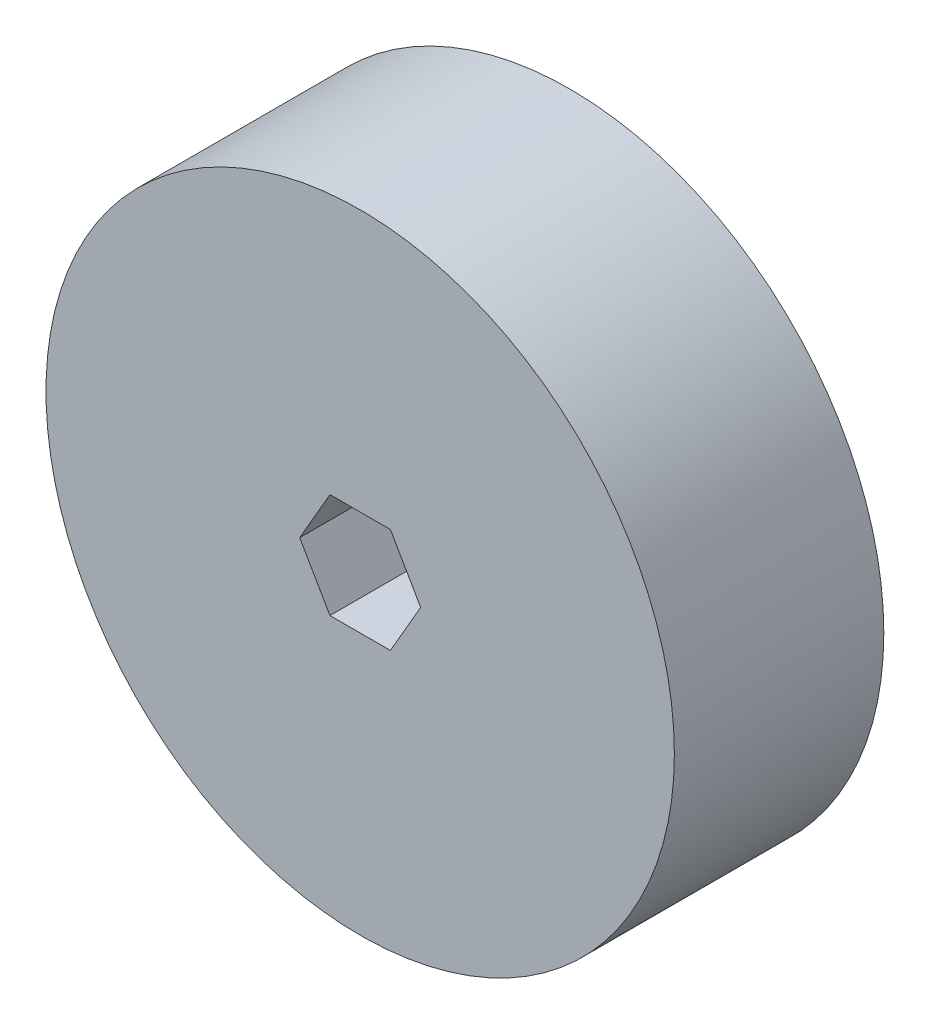
ISO-10303-21;
HEADER;
FILE_DESCRIPTION(('STEP AP214'),'2;1');
FILE_NAME('part.step','',(''),(''),'','','');
FILE_SCHEMA(('AUTOMOTIVE_DESIGN { 1 0 10303 214 1 1 1 1 }'));
ENDSEC;
DATA;
#1=APPLICATION_CONTEXT('core data for automotive mechanical design processes');
#2=APPLICATION_PROTOCOL_DEFINITION('international standard','automotive_design',2000,#1);
#3=PRODUCT_CONTEXT('',#1,'mechanical');
#4=PRODUCT('Part','Part','',(#3));
#5=PRODUCT_RELATED_PRODUCT_CATEGORY('part','',(#4));
#6=PRODUCT_DEFINITION_FORMATION('','',#4);
#7=PRODUCT_DEFINITION_CONTEXT('part definition',#1,'design');
#8=PRODUCT_DEFINITION('design','',#6,#7);
#9=PRODUCT_DEFINITION_SHAPE('','',#8);
#10=(LENGTH_UNIT() NAMED_UNIT(*) SI_UNIT(.MILLI.,.METRE.));
#11=(NAMED_UNIT(*) PLANE_ANGLE_UNIT() SI_UNIT($,.RADIAN.));
#12=(NAMED_UNIT(*) SI_UNIT($,.STERADIAN.) SOLID_ANGLE_UNIT());
#13=UNCERTAINTY_MEASURE_WITH_UNIT(LENGTH_MEASURE(1.E-05),#10,'distance_accuracy_value','');
#14=(GEOMETRIC_REPRESENTATION_CONTEXT(3) GLOBAL_UNCERTAINTY_ASSIGNED_CONTEXT((#13)) GLOBAL_UNIT_ASSIGNED_CONTEXT((#10,
#11,#12)) REPRESENTATION_CONTEXT('',''));
#15=CARTESIAN_POINT('',(0.,0.,0.));
#16=DIRECTION('',(0.,0.,1.));
#17=DIRECTION('',(1.,0.,0.));
#18=AXIS2_PLACEMENT_3D('',#15,#16,#17);
#19=CARTESIAN_POINT('',(0.,0.,25.4));
#20=DIRECTION('',(0.,0.,1.));
#21=DIRECTION('',(1.,0.,0.));
#22=AXIS2_PLACEMENT_3D('',#19,#20,#21);
#23=PLANE('',#22);
#24=CARTESIAN_POINT('',(0.,0.,25.4));
#25=DIRECTION('',(0.,0.,1.));
#26=DIRECTION('',(1.,0.,0.));
#27=AXIS2_PLACEMENT_3D('',#24,#25,#26);
#28=CIRCLE('',#27,38.1);
#29=CARTESIAN_POINT('',(38.1,0.,25.4));
#30=VERTEX_POINT('',#29);
#31=EDGE_CURVE('E11',#30,#30,#28,.T.);
#32=ORIENTED_EDGE('',*,*,#31,.T.);
#33=EDGE_LOOP('',(#32));
#34=FACE_BOUND('',#33,.T.);
#35=DIRECTION('',(-0.5,-0.866025403784438,0.));
#36=VECTOR('',#35,1.);
#37=CARTESIAN_POINT('',(-3.66617420935412,6.35,25.4));
#38=LINE('',#37,#36);
#39=CARTESIAN_POINT('',(-3.66617420935412,6.35,25.4));
#40=VERTEX_POINT('',#39);
#41=CARTESIAN_POINT('',(-7.33234841870825,0.,25.4));
#42=VERTEX_POINT('',#41);
#43=EDGE_CURVE('E114',#40,#42,#38,.T.);
#44=ORIENTED_EDGE('',*,*,#43,.F.);
#45=DIRECTION('',(-1.,0.,0.));
#46=VECTOR('',#45,1.);
#47=CARTESIAN_POINT('',(3.66617420935412,6.35,25.4));
#48=LINE('',#47,#46);
#49=CARTESIAN_POINT('',(3.66617420935412,6.35,25.4));
#50=VERTEX_POINT('',#49);
#51=EDGE_CURVE('E105',#50,#40,#48,.T.);
#52=ORIENTED_EDGE('',*,*,#51,.F.);
#53=DIRECTION('',(-0.5,0.866025403784439,0.));
#54=VECTOR('',#53,1.);
#55=CARTESIAN_POINT('',(7.33234841870825,0.,25.4));
#56=LINE('',#55,#54);
#57=CARTESIAN_POINT('',(7.33234841870825,0.,25.4));
#58=VERTEX_POINT('',#57);
#59=EDGE_CURVE('E139',#58,#50,#56,.T.);
#60=ORIENTED_EDGE('',*,*,#59,.F.);
#61=DIRECTION('',(0.5,0.866025403784438,0.));
#62=VECTOR('',#61,1.);
#63=CARTESIAN_POINT('',(3.66617420935413,-6.35,25.4));
#64=LINE('',#63,#62);
#65=CARTESIAN_POINT('',(3.66617420935413,-6.35,25.4));
#66=VERTEX_POINT('',#65);
#67=EDGE_CURVE('E136',#66,#58,#64,.T.);
#68=ORIENTED_EDGE('',*,*,#67,.F.);
#69=DIRECTION('',(1.,0.,0.));
#70=VECTOR('',#69,1.);
#71=CARTESIAN_POINT('',(-3.66617420935412,-6.35,25.4));
#72=LINE('',#71,#70);
#73=CARTESIAN_POINT('',(-3.66617420935412,-6.35,25.4));
#74=VERTEX_POINT('',#73);
#75=EDGE_CURVE('E131',#74,#66,#72,.T.);
#76=ORIENTED_EDGE('',*,*,#75,.F.);
#77=DIRECTION('',(0.5,-0.866025403784439,0.));
#78=VECTOR('',#77,1.);
#79=CARTESIAN_POINT('',(-7.33234841870825,0.,25.4));
#80=LINE('',#79,#78);
#81=EDGE_CURVE('E127',#42,#74,#80,.T.);
#82=ORIENTED_EDGE('',*,*,#81,.F.);
#83=EDGE_LOOP('',(#44,#52,#60,#68,#76,#82));
#84=FACE_BOUND('',#83,.T.);
#85=ADVANCED_FACE('F51',(#34,#84),#23,.T.);
#86=CARTESIAN_POINT('',(0.,0.,0.));
#87=DIRECTION('',(0.,0.,1.));
#88=DIRECTION('',(1.,0.,0.));
#89=AXIS2_PLACEMENT_3D('',#86,#87,#88);
#90=PLANE('',#89);
#91=CARTESIAN_POINT('',(0.,0.,0.));
#92=DIRECTION('',(0.,0.,1.));
#93=DIRECTION('',(1.,0.,0.));
#94=AXIS2_PLACEMENT_3D('',#91,#92,#93);
#95=CIRCLE('',#94,38.1);
#96=CARTESIAN_POINT('',(38.1,0.,0.));
#97=VERTEX_POINT('',#96);
#98=EDGE_CURVE('E55',#97,#97,#95,.T.);
#99=ORIENTED_EDGE('',*,*,#98,.F.);
#100=EDGE_LOOP('',(#99));
#101=FACE_BOUND('',#100,.T.);
#102=DIRECTION('',(-1.,0.,0.));
#103=VECTOR('',#102,1.);
#104=CARTESIAN_POINT('',(3.66617420935412,6.35,0.));
#105=LINE('',#104,#103);
#106=CARTESIAN_POINT('',(3.66617420935412,6.35,0.));
#107=VERTEX_POINT('',#106);
#108=CARTESIAN_POINT('',(-3.66617420935412,6.35,0.));
#109=VERTEX_POINT('',#108);
#110=EDGE_CURVE('E75',#107,#109,#105,.T.);
#111=ORIENTED_EDGE('',*,*,#110,.T.);
#112=DIRECTION('',(-0.5,-0.866025403784438,0.));
#113=VECTOR('',#112,1.);
#114=CARTESIAN_POINT('',(-3.66617420935412,6.35,0.));
#115=LINE('',#114,#113);
#116=CARTESIAN_POINT('',(-7.33234841870825,0.,0.));
#117=VERTEX_POINT('',#116);
#118=EDGE_CURVE('E121',#109,#117,#115,.T.);
#119=ORIENTED_EDGE('',*,*,#118,.T.);
#120=DIRECTION('',(0.5,-0.866025403784439,0.));
#121=VECTOR('',#120,1.);
#122=CARTESIAN_POINT('',(-7.33234841870825,0.,0.));
#123=LINE('',#122,#121);
#124=CARTESIAN_POINT('',(-3.66617420935412,-6.35,0.));
#125=VERTEX_POINT('',#124);
#126=EDGE_CURVE('E146',#117,#125,#123,.T.);
#127=ORIENTED_EDGE('',*,*,#126,.T.);
#128=DIRECTION('',(1.,0.,0.));
#129=VECTOR('',#128,1.);
#130=CARTESIAN_POINT('',(-3.66617420935412,-6.35,0.));
#131=LINE('',#130,#129);
#132=CARTESIAN_POINT('',(3.66617420935413,-6.35,0.));
#133=VERTEX_POINT('',#132);
#134=EDGE_CURVE('E150',#125,#133,#131,.T.);
#135=ORIENTED_EDGE('',*,*,#134,.T.);
#136=DIRECTION('',(0.5,0.866025403784438,0.));
#137=VECTOR('',#136,1.);
#138=CARTESIAN_POINT('',(3.66617420935413,-6.35,0.));
#139=LINE('',#138,#137);
#140=CARTESIAN_POINT('',(7.33234841870825,0.,0.));
#141=VERTEX_POINT('',#140);
#142=EDGE_CURVE('E154',#133,#141,#139,.T.);
#143=ORIENTED_EDGE('',*,*,#142,.T.);
#144=DIRECTION('',(-0.5,0.866025403784439,0.));
#145=VECTOR('',#144,1.);
#146=CARTESIAN_POINT('',(7.33234841870825,0.,0.));
#147=LINE('',#146,#145);
#148=EDGE_CURVE('E115',#141,#107,#147,.T.);
#149=ORIENTED_EDGE('',*,*,#148,.T.);
#150=EDGE_LOOP('',(#111,#119,#127,#135,#143,#149));
#151=FACE_BOUND('',#150,.T.);
#152=ADVANCED_FACE('F178',(#101,#151),#90,.F.);
#153=CARTESIAN_POINT('',(0.,0.,25.4));
#154=DIRECTION('',(0.,0.,-1.));
#155=DIRECTION('',(-1.,0.,0.));
#156=AXIS2_PLACEMENT_3D('',#153,#154,#155);
#157=CYLINDRICAL_SURFACE('',#156,38.1);
#158=ORIENTED_EDGE('',*,*,#31,.F.);
#159=EDGE_LOOP('',(#158));
#160=FACE_BOUND('',#159,.T.);
#161=ORIENTED_EDGE('',*,*,#98,.T.);
#162=EDGE_LOOP('',(#161));
#163=FACE_BOUND('',#162,.T.);
#164=ADVANCED_FACE('F53',(#160,#163),#157,.T.);
#165=CARTESIAN_POINT('',(3.66617420935412,6.35,25.4));
#166=DIRECTION('',(0.,-1.,0.));
#167=DIRECTION('',(0.,0.,-1.));
#168=AXIS2_PLACEMENT_3D('',#165,#166,#167);
#169=PLANE('',#168);
#170=ORIENTED_EDGE('',*,*,#110,.F.);
#171=DIRECTION('',(0.,0.,-1.));
#172=VECTOR('',#171,1.);
#173=CARTESIAN_POINT('',(3.66617420935412,6.35,25.4));
#174=LINE('',#173,#172);
#175=EDGE_CURVE('E109',#50,#107,#174,.T.);
#176=ORIENTED_EDGE('',*,*,#175,.F.);
#177=ORIENTED_EDGE('',*,*,#51,.T.);
#178=DIRECTION('',(0.,0.,-1.));
#179=VECTOR('',#178,1.);
#180=CARTESIAN_POINT('',(-3.66617420935412,6.35,25.4));
#181=LINE('',#180,#179);
#182=EDGE_CURVE('E108',#40,#109,#181,.T.);
#183=ORIENTED_EDGE('',*,*,#182,.T.);
#184=EDGE_LOOP('',(#170,#176,#177,#183));
#185=FACE_BOUND('',#184,.T.);
#186=ADVANCED_FACE('F107',(#185),#169,.T.);
#187=CARTESIAN_POINT('',(-3.66617420935412,6.35,25.4));
#188=DIRECTION('',(0.866025403784438,-0.5,0.));
#189=DIRECTION('',(0.5,0.866025403784439,0.));
#190=AXIS2_PLACEMENT_3D('',#187,#188,#189);
#191=PLANE('',#190);
#192=ORIENTED_EDGE('',*,*,#118,.F.);
#193=ORIENTED_EDGE('',*,*,#182,.F.);
#194=ORIENTED_EDGE('',*,*,#43,.T.);
#195=DIRECTION('',(0.,0.,-1.));
#196=VECTOR('',#195,1.);
#197=CARTESIAN_POINT('',(-7.33234841870825,0.,25.4));
#198=LINE('',#197,#196);
#199=EDGE_CURVE('E123',#42,#117,#198,.T.);
#200=ORIENTED_EDGE('',*,*,#199,.T.);
#201=EDGE_LOOP('',(#192,#193,#194,#200));
#202=FACE_BOUND('',#201,.T.);
#203=ADVANCED_FACE('F118',(#202),#191,.T.);
#204=CARTESIAN_POINT('',(-7.33234841870825,0.,25.4));
#205=DIRECTION('',(0.866025403784439,0.5,0.));
#206=DIRECTION('',(-0.5,0.866025403784439,0.));
#207=AXIS2_PLACEMENT_3D('',#204,#205,#206);
#208=PLANE('',#207);
#209=ORIENTED_EDGE('',*,*,#126,.F.);
#210=ORIENTED_EDGE('',*,*,#199,.F.);
#211=ORIENTED_EDGE('',*,*,#81,.T.);
#212=DIRECTION('',(0.,0.,-1.));
#213=VECTOR('',#212,1.);
#214=CARTESIAN_POINT('',(-3.66617420935412,-6.35,25.4));
#215=LINE('',#214,#213);
#216=EDGE_CURVE('E168',#74,#125,#215,.T.);
#217=ORIENTED_EDGE('',*,*,#216,.T.);
#218=EDGE_LOOP('',(#209,#210,#211,#217));
#219=FACE_BOUND('',#218,.T.);
#220=ADVANCED_FACE('F174',(#219),#208,.T.);
#221=CARTESIAN_POINT('',(-3.66617420935412,-6.35,25.4));
#222=DIRECTION('',(0.,1.,0.));
#223=DIRECTION('',(0.,0.,1.));
#224=AXIS2_PLACEMENT_3D('',#221,#222,#223);
#225=PLANE('',#224);
#226=ORIENTED_EDGE('',*,*,#134,.F.);
#227=ORIENTED_EDGE('',*,*,#216,.F.);
#228=ORIENTED_EDGE('',*,*,#75,.T.);
#229=DIRECTION('',(0.,0.,-1.));
#230=VECTOR('',#229,1.);
#231=CARTESIAN_POINT('',(3.66617420935413,-6.35,25.4));
#232=LINE('',#231,#230);
#233=EDGE_CURVE('E165',#66,#133,#232,.T.);
#234=ORIENTED_EDGE('',*,*,#233,.T.);
#235=EDGE_LOOP('',(#226,#227,#228,#234));
#236=FACE_BOUND('',#235,.T.);
#237=ADVANCED_FACE('F186',(#236),#225,.T.);
#238=CARTESIAN_POINT('',(3.66617420935413,-6.35,25.4));
#239=DIRECTION('',(-0.866025403784438,0.5,0.));
#240=DIRECTION('',(-0.5,-0.866025403784439,0.));
#241=AXIS2_PLACEMENT_3D('',#238,#239,#240);
#242=PLANE('',#241);
#243=ORIENTED_EDGE('',*,*,#142,.F.);
#244=ORIENTED_EDGE('',*,*,#233,.F.);
#245=ORIENTED_EDGE('',*,*,#67,.T.);
#246=DIRECTION('',(0.,0.,-1.));
#247=VECTOR('',#246,1.);
#248=CARTESIAN_POINT('',(7.33234841870825,0.,25.4));
#249=LINE('',#248,#247);
#250=EDGE_CURVE('E67',#58,#141,#249,.T.);
#251=ORIENTED_EDGE('',*,*,#250,.T.);
#252=EDGE_LOOP('',(#243,#244,#245,#251));
#253=FACE_BOUND('',#252,.T.);
#254=ADVANCED_FACE('F184',(#253),#242,.T.);
#255=CARTESIAN_POINT('',(7.33234841870825,0.,25.4));
#256=DIRECTION('',(-0.866025403784439,-0.5,0.));
#257=DIRECTION('',(0.5,-0.866025403784439,0.));
#258=AXIS2_PLACEMENT_3D('',#255,#256,#257);
#259=PLANE('',#258);
#260=ORIENTED_EDGE('',*,*,#148,.F.);
#261=ORIENTED_EDGE('',*,*,#250,.F.);
#262=ORIENTED_EDGE('',*,*,#59,.T.);
#263=ORIENTED_EDGE('',*,*,#175,.T.);
#264=EDGE_LOOP('',(#260,#261,#262,#263));
#265=FACE_BOUND('',#264,.T.);
#266=ADVANCED_FACE('F180',(#265),#259,.T.);
#267=CLOSED_SHELL('',(#85,#152,#164,#186,#203,#220,#237,#254,#266));
#268=MANIFOLD_SOLID_BREP('B2',#267);
#269=ADVANCED_BREP_SHAPE_REPRESENTATION('',(#18,#268),#14);
#270=SHAPE_DEFINITION_REPRESENTATION(#9,#269);
ENDSEC;
END-ISO-10303-21;
